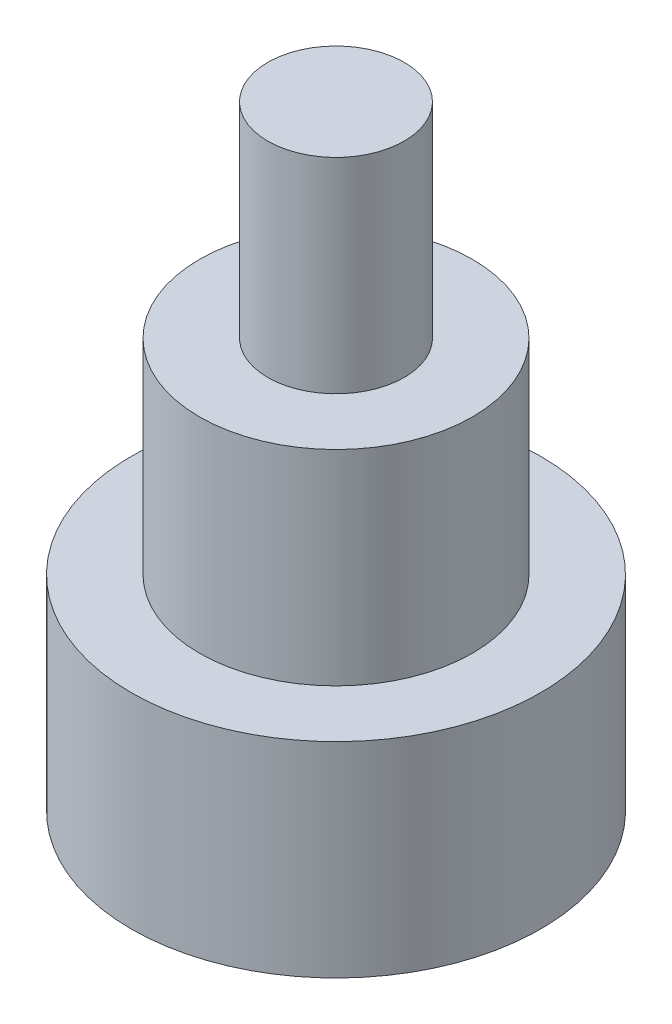
ISO-10303-21;
HEADER;
FILE_DESCRIPTION(('STEP AP214'),'2;1');
FILE_NAME('part.step','',(''),(''),'','','');
FILE_SCHEMA(('AUTOMOTIVE_DESIGN { 1 0 10303 214 1 1 1 1 }'));
ENDSEC;
DATA;
#1=APPLICATION_CONTEXT('core data for automotive mechanical design processes');
#2=APPLICATION_PROTOCOL_DEFINITION('international standard','automotive_design',2000,#1);
#3=PRODUCT_CONTEXT('',#1,'mechanical');
#4=PRODUCT('Part','Part','',(#3));
#5=PRODUCT_RELATED_PRODUCT_CATEGORY('part','',(#4));
#6=PRODUCT_DEFINITION_FORMATION('','',#4);
#7=PRODUCT_DEFINITION_CONTEXT('part definition',#1,'design');
#8=PRODUCT_DEFINITION('design','',#6,#7);
#9=PRODUCT_DEFINITION_SHAPE('','',#8);
#10=(LENGTH_UNIT() NAMED_UNIT(*) SI_UNIT(.MILLI.,.METRE.));
#11=(NAMED_UNIT(*) PLANE_ANGLE_UNIT() SI_UNIT($,.RADIAN.));
#12=(NAMED_UNIT(*) SI_UNIT($,.STERADIAN.) SOLID_ANGLE_UNIT());
#13=UNCERTAINTY_MEASURE_WITH_UNIT(LENGTH_MEASURE(1.E-05),#10,'distance_accuracy_value','');
#14=(GEOMETRIC_REPRESENTATION_CONTEXT(3) GLOBAL_UNCERTAINTY_ASSIGNED_CONTEXT((#13)) GLOBAL_UNIT_ASSIGNED_CONTEXT((#10,
#11,#12)) REPRESENTATION_CONTEXT('',''));
#15=CARTESIAN_POINT('',(0.,0.,0.));
#16=DIRECTION('',(0.,0.,1.));
#17=DIRECTION('',(1.,0.,0.));
#18=AXIS2_PLACEMENT_3D('',#15,#16,#17);
#19=CARTESIAN_POINT('',(-14.0948511343482,30.,-0.923455763974535));
#20=DIRECTION('',(0.,-1.,0.));
#21=DIRECTION('',(0.,0.,-1.));
#22=AXIS2_PLACEMENT_3D('',#19,#20,#21);
#23=CYLINDRICAL_SURFACE('',#22,30.);
#24=CARTESIAN_POINT('',(-14.0948511343482,30.,-0.923455763974535));
#25=DIRECTION('',(0.,1.,0.));
#26=DIRECTION('',(0.,0.,1.));
#27=AXIS2_PLACEMENT_3D('',#24,#25,#26);
#28=CIRCLE('',#27,30.);
#29=CARTESIAN_POINT('',(-14.0948511343482,30.,29.0765442360255));
#30=VERTEX_POINT('',#29);
#31=EDGE_CURVE('E43',#30,#30,#28,.T.);
#32=ORIENTED_EDGE('',*,*,#31,.F.);
#33=EDGE_LOOP('',(#32));
#34=FACE_BOUND('',#33,.T.);
#35=CARTESIAN_POINT('',(-14.0948511343482,0.,-0.923455763974535));
#36=DIRECTION('',(0.,1.,0.));
#37=DIRECTION('',(0.,0.,1.));
#38=AXIS2_PLACEMENT_3D('',#35,#36,#37);
#39=CIRCLE('',#38,30.);
#40=CARTESIAN_POINT('',(-14.0948511343482,0.,29.0765442360255));
#41=VERTEX_POINT('',#40);
#42=EDGE_CURVE('E34',#41,#41,#39,.T.);
#43=ORIENTED_EDGE('',*,*,#42,.T.);
#44=EDGE_LOOP('',(#43));
#45=FACE_BOUND('',#44,.T.);
#46=ADVANCED_FACE('F31',(#34,#45),#23,.T.);
#47=CARTESIAN_POINT('',(-14.0948511343482,30.,-0.923455763974535));
#48=DIRECTION('',(0.,1.,0.));
#49=DIRECTION('',(0.,0.,1.));
#50=AXIS2_PLACEMENT_3D('',#47,#48,#49);
#51=PLANE('',#50);
#52=CARTESIAN_POINT('',(-14.0948511343482,30.,-0.923455763974535));
#53=DIRECTION('',(0.,1.,0.));
#54=DIRECTION('',(0.,0.,1.));
#55=AXIS2_PLACEMENT_3D('',#52,#53,#54);
#56=CIRCLE('',#55,20.);
#57=CARTESIAN_POINT('',(-14.0948511343482,30.,19.0765442360255));
#58=VERTEX_POINT('',#57);
#59=EDGE_CURVE('E38',#58,#58,#56,.T.);
#60=ORIENTED_EDGE('',*,*,#59,.F.);
#61=EDGE_LOOP('',(#60));
#62=FACE_BOUND('',#61,.T.);
#63=ORIENTED_EDGE('',*,*,#31,.T.);
#64=EDGE_LOOP('',(#63));
#65=FACE_BOUND('',#64,.T.);
#66=ADVANCED_FACE('F60',(#62,#65),#51,.T.);
#67=CARTESIAN_POINT('',(-14.0948511343482,0.,-0.923455763974535));
#68=DIRECTION('',(0.,1.,0.));
#69=DIRECTION('',(0.,0.,1.));
#70=AXIS2_PLACEMENT_3D('',#67,#68,#69);
#71=PLANE('',#70);
#72=ORIENTED_EDGE('',*,*,#42,.F.);
#73=EDGE_LOOP('',(#72));
#74=FACE_BOUND('',#73,.T.);
#75=ADVANCED_FACE('F57',(#74),#71,.F.);
#76=CARTESIAN_POINT('',(-14.0948511343482,60.,-0.923455763974535));
#77=DIRECTION('',(0.,-1.,0.));
#78=DIRECTION('',(0.,0.,-1.));
#79=AXIS2_PLACEMENT_3D('',#76,#77,#78);
#80=CYLINDRICAL_SURFACE('',#79,20.);
#81=CARTESIAN_POINT('',(-14.0948511343482,60.,-0.923455763974535));
#82=DIRECTION('',(0.,1.,0.));
#83=DIRECTION('',(0.,0.,1.));
#84=AXIS2_PLACEMENT_3D('',#81,#82,#83);
#85=CIRCLE('',#84,20.);
#86=CARTESIAN_POINT('',(-14.0948511343482,60.,19.0765442360255));
#87=VERTEX_POINT('',#86);
#88=EDGE_CURVE('E48',#87,#87,#85,.T.);
#89=ORIENTED_EDGE('',*,*,#88,.F.);
#90=EDGE_LOOP('',(#89));
#91=FACE_BOUND('',#90,.T.);
#92=ORIENTED_EDGE('',*,*,#59,.T.);
#93=EDGE_LOOP('',(#92));
#94=FACE_BOUND('',#93,.T.);
#95=ADVANCED_FACE('F59',(#91,#94),#80,.T.);
#96=CARTESIAN_POINT('',(-14.0948511343482,60.,-0.923455763974535));
#97=DIRECTION('',(0.,1.,0.));
#98=DIRECTION('',(0.,0.,1.));
#99=AXIS2_PLACEMENT_3D('',#96,#97,#98);
#100=PLANE('',#99);
#101=CARTESIAN_POINT('',(-14.0948511343482,60.,-0.923455763974535));
#102=DIRECTION('',(0.,1.,0.));
#103=DIRECTION('',(0.,0.,1.));
#104=AXIS2_PLACEMENT_3D('',#101,#102,#103);
#105=CIRCLE('',#104,10.);
#106=CARTESIAN_POINT('',(-14.0948511343482,60.,9.07654423602547));
#107=VERTEX_POINT('',#106);
#108=EDGE_CURVE('E10',#107,#107,#105,.T.);
#109=ORIENTED_EDGE('',*,*,#108,.F.);
#110=EDGE_LOOP('',(#109));
#111=FACE_BOUND('',#110,.T.);
#112=ORIENTED_EDGE('',*,*,#88,.T.);
#113=EDGE_LOOP('',(#112));
#114=FACE_BOUND('',#113,.T.);
#115=ADVANCED_FACE('F65',(#111,#114),#100,.T.);
#116=CARTESIAN_POINT('',(-14.0948511343482,90.,-0.923455763974535));
#117=DIRECTION('',(0.,-1.,0.));
#118=DIRECTION('',(0.,0.,-1.));
#119=AXIS2_PLACEMENT_3D('',#116,#117,#118);
#120=CYLINDRICAL_SURFACE('',#119,10.);
#121=CARTESIAN_POINT('',(-14.0948511343482,90.,-0.923455763974535));
#122=DIRECTION('',(0.,1.,0.));
#123=DIRECTION('',(0.,0.,1.));
#124=AXIS2_PLACEMENT_3D('',#121,#122,#123);
#125=CIRCLE('',#124,10.);
#126=CARTESIAN_POINT('',(-14.0948511343482,90.,9.07654423602547));
#127=VERTEX_POINT('',#126);
#128=EDGE_CURVE('E47',#127,#127,#125,.T.);
#129=ORIENTED_EDGE('',*,*,#128,.F.);
#130=EDGE_LOOP('',(#129));
#131=FACE_BOUND('',#130,.T.);
#132=ORIENTED_EDGE('',*,*,#108,.T.);
#133=EDGE_LOOP('',(#132));
#134=FACE_BOUND('',#133,.T.);
#135=ADVANCED_FACE('F95',(#131,#134),#120,.T.);
#136=CARTESIAN_POINT('',(-14.0948511343482,90.,-0.923455763974535));
#137=DIRECTION('',(0.,1.,0.));
#138=DIRECTION('',(0.,0.,1.));
#139=AXIS2_PLACEMENT_3D('',#136,#137,#138);
#140=PLANE('',#139);
#141=ORIENTED_EDGE('',*,*,#128,.T.);
#142=EDGE_LOOP('',(#141));
#143=FACE_BOUND('',#142,.T.);
#144=ADVANCED_FACE('F105',(#143),#140,.T.);
#145=CLOSED_SHELL('',(#46,#66,#75,#95,#115,#135,#144));
#146=MANIFOLD_SOLID_BREP('B2',#145);
#147=ADVANCED_BREP_SHAPE_REPRESENTATION('',(#18,#146),#14);
#148=SHAPE_DEFINITION_REPRESENTATION(#9,#147);
ENDSEC;
END-ISO-10303-21;
